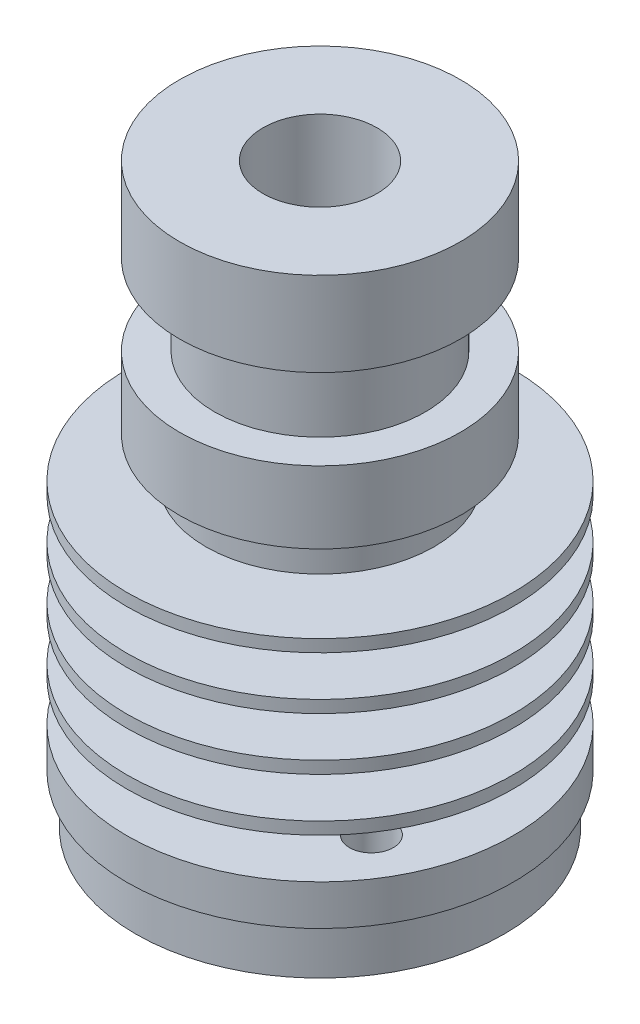
ISO-10303-21;
HEADER;
FILE_DESCRIPTION(('STEP AP214'),'2;1');
FILE_NAME('part.step','',(''),(''),'','','');
FILE_SCHEMA(('AUTOMOTIVE_DESIGN { 1 0 10303 214 1 1 1 1 }'));
ENDSEC;
DATA;
#1=APPLICATION_CONTEXT('core data for automotive mechanical design processes');
#2=APPLICATION_PROTOCOL_DEFINITION('international standard','automotive_design',2000,#1);
#3=PRODUCT_CONTEXT('',#1,'mechanical');
#4=PRODUCT('Part','Part','',(#3));
#5=PRODUCT_RELATED_PRODUCT_CATEGORY('part','',(#4));
#6=PRODUCT_DEFINITION_FORMATION('','',#4);
#7=PRODUCT_DEFINITION_CONTEXT('part definition',#1,'design');
#8=PRODUCT_DEFINITION('design','',#6,#7);
#9=PRODUCT_DEFINITION_SHAPE('','',#8);
#10=(LENGTH_UNIT() NAMED_UNIT(*) SI_UNIT(.MILLI.,.METRE.));
#11=(NAMED_UNIT(*) PLANE_ANGLE_UNIT() SI_UNIT($,.RADIAN.));
#12=(NAMED_UNIT(*) SI_UNIT($,.STERADIAN.) SOLID_ANGLE_UNIT());
#13=UNCERTAINTY_MEASURE_WITH_UNIT(LENGTH_MEASURE(1.E-05),#10,'distance_accuracy_value','');
#14=(GEOMETRIC_REPRESENTATION_CONTEXT(3) GLOBAL_UNCERTAINTY_ASSIGNED_CONTEXT((#13)) GLOBAL_UNIT_ASSIGNED_CONTEXT((#10,
#11,#12)) REPRESENTATION_CONTEXT('',''));
#15=CARTESIAN_POINT('',(0.,0.,0.));
#16=DIRECTION('',(0.,0.,1.));
#17=DIRECTION('',(1.,0.,0.));
#18=AXIS2_PLACEMENT_3D('',#15,#16,#17);
#19=CARTESIAN_POINT('',(11.,2.80000000000002,0.));
#20=DIRECTION('',(0.,-1.,0.));
#21=DIRECTION('',(0.,0.,-1.));
#22=AXIS2_PLACEMENT_3D('',#19,#20,#21);
#23=PLANE('',#22);
#24=CARTESIAN_POINT('',(0.,2.80000000000002,0.));
#25=DIRECTION('',(0.,1.,0.));
#26=DIRECTION('',(0.,0.,1.));
#27=AXIS2_PLACEMENT_3D('',#24,#25,#26);
#28=CIRCLE('',#27,11.);
#29=CARTESIAN_POINT('',(0.,2.80000000000002,11.));
#30=VERTEX_POINT('',#29);
#31=EDGE_CURVE('E50',#30,#30,#28,.T.);
#32=ORIENTED_EDGE('',*,*,#31,.F.);
#33=EDGE_LOOP('',(#32));
#34=FACE_BOUND('',#33,.T.);
#35=CARTESIAN_POINT('',(0.,2.80000000000002,0.));
#36=DIRECTION('',(0.,-1.,0.));
#37=DIRECTION('',(0.,0.,-1.));
#38=AXIS2_PLACEMENT_3D('',#35,#36,#37);
#39=CIRCLE('',#38,10.5);
#40=CARTESIAN_POINT('',(0.,2.80000000000002,-10.5));
#41=VERTEX_POINT('',#40);
#42=EDGE_CURVE('E142',#41,#41,#39,.T.);
#43=ORIENTED_EDGE('',*,*,#42,.F.);
#44=EDGE_LOOP('',(#43));
#45=FACE_BOUND('',#44,.T.);
#46=ADVANCED_FACE('F30',(#34,#45),#23,.T.);
#47=CARTESIAN_POINT('',(0.,2.80000000000002,0.));
#48=DIRECTION('',(0.,1.,0.));
#49=DIRECTION('',(0.,0.,1.));
#50=AXIS2_PLACEMENT_3D('',#47,#48,#49);
#51=CYLINDRICAL_SURFACE('',#50,11.);
#52=ORIENTED_EDGE('',*,*,#31,.T.);
#53=EDGE_LOOP('',(#52));
#54=FACE_BOUND('',#53,.T.);
#55=CARTESIAN_POINT('',(0.,5.10000000000002,0.));
#56=DIRECTION('',(0.,1.,0.));
#57=DIRECTION('',(0.,0.,1.));
#58=AXIS2_PLACEMENT_3D('',#55,#56,#57);
#59=CIRCLE('',#58,11.);
#60=CARTESIAN_POINT('',(0.,5.10000000000002,11.));
#61=VERTEX_POINT('',#60);
#62=EDGE_CURVE('E138',#61,#61,#59,.T.);
#63=ORIENTED_EDGE('',*,*,#62,.F.);
#64=EDGE_LOOP('',(#63));
#65=FACE_BOUND('',#64,.T.);
#66=ADVANCED_FACE('F327',(#54,#65),#51,.T.);
#67=CARTESIAN_POINT('',(0.,32.9,0.));
#68=DIRECTION('',(0.,1.,0.));
#69=DIRECTION('',(0.,0.,1.));
#70=AXIS2_PLACEMENT_3D('',#67,#68,#69);
#71=PLANE('',#70);
#72=CARTESIAN_POINT('',(0.,32.8999999999993,0.));
#73=DIRECTION('',(0.,1.,0.));
#74=DIRECTION('',(-1.,0.,0.));
#75=AXIS2_PLACEMENT_3D('',#72,#73,#74);
#76=CIRCLE('',#75,3.24999999997932);
#77=CARTESIAN_POINT('',(-3.24999999997932,32.8999999999993,0.));
#78=VERTEX_POINT('',#77);
#79=EDGE_CURVE('E150',#78,#78,#76,.T.);
#80=ORIENTED_EDGE('',*,*,#79,.F.);
#81=EDGE_LOOP('',(#80));
#82=FACE_BOUND('',#81,.T.);
#83=CARTESIAN_POINT('',(0.,32.9,0.));
#84=DIRECTION('',(0.,1.,0.));
#85=DIRECTION('',(0.,0.,1.));
#86=AXIS2_PLACEMENT_3D('',#83,#84,#85);
#87=CIRCLE('',#86,8.00000000000011);
#88=CARTESIAN_POINT('',(0.,32.9,8.00000000000011));
#89=VERTEX_POINT('',#88);
#90=EDGE_CURVE('E66',#89,#89,#87,.T.);
#91=ORIENTED_EDGE('',*,*,#90,.T.);
#92=EDGE_LOOP('',(#91));
#93=FACE_BOUND('',#92,.T.);
#94=ADVANCED_FACE('F322',(#82,#93),#71,.T.);
#95=CARTESIAN_POINT('',(0.,2.80000000000002,0.));
#96=DIRECTION('',(0.,1.,0.));
#97=DIRECTION('',(0.,0.,1.));
#98=AXIS2_PLACEMENT_3D('',#95,#96,#97);
#99=CYLINDRICAL_SURFACE('',#98,8.00000000000011);
#100=CARTESIAN_POINT('',(0.,28.1,0.));
#101=DIRECTION('',(0.,1.,0.));
#102=DIRECTION('',(0.,0.,1.));
#103=AXIS2_PLACEMENT_3D('',#100,#101,#102);
#104=CIRCLE('',#103,8.00000000000011);
#105=CARTESIAN_POINT('',(0.,28.1,8.00000000000011));
#106=VERTEX_POINT('',#105);
#107=EDGE_CURVE('E69',#106,#106,#104,.T.);
#108=ORIENTED_EDGE('',*,*,#107,.T.);
#109=EDGE_LOOP('',(#108));
#110=FACE_BOUND('',#109,.T.);
#111=ORIENTED_EDGE('',*,*,#90,.F.);
#112=EDGE_LOOP('',(#111));
#113=FACE_BOUND('',#112,.T.);
#114=ADVANCED_FACE('F316',(#110,#113),#99,.T.);
#115=CARTESIAN_POINT('',(8.00000000000011,28.1,0.));
#116=DIRECTION('',(0.,-1.,0.));
#117=DIRECTION('',(0.,0.,-1.));
#118=AXIS2_PLACEMENT_3D('',#115,#116,#117);
#119=PLANE('',#118);
#120=CARTESIAN_POINT('',(0.,28.1,0.));
#121=DIRECTION('',(0.,1.,0.));
#122=DIRECTION('',(0.,0.,1.));
#123=AXIS2_PLACEMENT_3D('',#120,#121,#122);
#124=CIRCLE('',#123,6.00000000000008);
#125=CARTESIAN_POINT('',(0.,28.1,6.00000000000008));
#126=VERTEX_POINT('',#125);
#127=EDGE_CURVE('E72',#126,#126,#124,.T.);
#128=ORIENTED_EDGE('',*,*,#127,.T.);
#129=EDGE_LOOP('',(#128));
#130=FACE_BOUND('',#129,.T.);
#131=ORIENTED_EDGE('',*,*,#107,.F.);
#132=EDGE_LOOP('',(#131));
#133=FACE_BOUND('',#132,.T.);
#134=ADVANCED_FACE('F310',(#130,#133),#119,.T.);
#135=CARTESIAN_POINT('',(0.,2.80000000000002,0.));
#136=DIRECTION('',(0.,1.,0.));
#137=DIRECTION('',(0.,0.,1.));
#138=AXIS2_PLACEMENT_3D('',#135,#136,#137);
#139=CYLINDRICAL_SURFACE('',#138,6.00000000000008);
#140=CARTESIAN_POINT('',(0.,23.5,0.));
#141=DIRECTION('',(0.,1.,0.));
#142=DIRECTION('',(0.,0.,1.));
#143=AXIS2_PLACEMENT_3D('',#140,#141,#142);
#144=CIRCLE('',#143,6.00000000000008);
#145=CARTESIAN_POINT('',(0.,23.5,6.00000000000008));
#146=VERTEX_POINT('',#145);
#147=EDGE_CURVE('E75',#146,#146,#144,.T.);
#148=ORIENTED_EDGE('',*,*,#147,.T.);
#149=EDGE_LOOP('',(#148));
#150=FACE_BOUND('',#149,.T.);
#151=ORIENTED_EDGE('',*,*,#127,.F.);
#152=EDGE_LOOP('',(#151));
#153=FACE_BOUND('',#152,.T.);
#154=ADVANCED_FACE('F304',(#150,#153),#139,.T.);
#155=CARTESIAN_POINT('',(6.00000000000008,23.5,0.));
#156=DIRECTION('',(0.,1.,0.));
#157=DIRECTION('',(0.,0.,1.));
#158=AXIS2_PLACEMENT_3D('',#155,#156,#157);
#159=PLANE('',#158);
#160=CARTESIAN_POINT('',(0.,23.5,0.));
#161=DIRECTION('',(0.,1.,0.));
#162=DIRECTION('',(0.,0.,1.));
#163=AXIS2_PLACEMENT_3D('',#160,#161,#162);
#164=CIRCLE('',#163,8.00000000000012);
#165=CARTESIAN_POINT('',(0.,23.5,8.00000000000012));
#166=VERTEX_POINT('',#165);
#167=EDGE_CURVE('E78',#166,#166,#164,.T.);
#168=ORIENTED_EDGE('',*,*,#167,.T.);
#169=EDGE_LOOP('',(#168));
#170=FACE_BOUND('',#169,.T.);
#171=ORIENTED_EDGE('',*,*,#147,.F.);
#172=EDGE_LOOP('',(#171));
#173=FACE_BOUND('',#172,.T.);
#174=ADVANCED_FACE('F298',(#170,#173),#159,.T.);
#175=CARTESIAN_POINT('',(0.,2.80000000000002,0.));
#176=DIRECTION('',(0.,1.,0.));
#177=DIRECTION('',(0.,0.,1.));
#178=AXIS2_PLACEMENT_3D('',#175,#176,#177);
#179=CYLINDRICAL_SURFACE('',#178,8.00000000000012);
#180=CARTESIAN_POINT('',(0.,19.4,0.));
#181=DIRECTION('',(0.,1.,0.));
#182=DIRECTION('',(0.,0.,1.));
#183=AXIS2_PLACEMENT_3D('',#180,#181,#182);
#184=CIRCLE('',#183,8.00000000000012);
#185=CARTESIAN_POINT('',(0.,19.4,8.00000000000012));
#186=VERTEX_POINT('',#185);
#187=EDGE_CURVE('E81',#186,#186,#184,.T.);
#188=ORIENTED_EDGE('',*,*,#187,.T.);
#189=EDGE_LOOP('',(#188));
#190=FACE_BOUND('',#189,.T.);
#191=ORIENTED_EDGE('',*,*,#167,.F.);
#192=EDGE_LOOP('',(#191));
#193=FACE_BOUND('',#192,.T.);
#194=ADVANCED_FACE('F292',(#190,#193),#179,.T.);
#195=CARTESIAN_POINT('',(8.00000000000012,19.4,0.));
#196=DIRECTION('',(0.,-1.,0.));
#197=DIRECTION('',(0.,0.,-1.));
#198=AXIS2_PLACEMENT_3D('',#195,#196,#197);
#199=PLANE('',#198);
#200=CARTESIAN_POINT('',(0.,19.4,0.));
#201=DIRECTION('',(0.,1.,0.));
#202=DIRECTION('',(0.,0.,1.));
#203=AXIS2_PLACEMENT_3D('',#200,#201,#202);
#204=CIRCLE('',#203,6.50000000000001);
#205=CARTESIAN_POINT('',(0.,19.4,6.50000000000001));
#206=VERTEX_POINT('',#205);
#207=EDGE_CURVE('E84',#206,#206,#204,.T.);
#208=ORIENTED_EDGE('',*,*,#207,.T.);
#209=EDGE_LOOP('',(#208));
#210=FACE_BOUND('',#209,.T.);
#211=ORIENTED_EDGE('',*,*,#187,.F.);
#212=EDGE_LOOP('',(#211));
#213=FACE_BOUND('',#212,.T.);
#214=ADVANCED_FACE('F286',(#210,#213),#199,.T.);
#215=CARTESIAN_POINT('',(0.,2.80000000000002,0.));
#216=DIRECTION('',(0.,1.,0.));
#217=DIRECTION('',(0.,0.,1.));
#218=AXIS2_PLACEMENT_3D('',#215,#216,#217);
#219=CYLINDRICAL_SURFACE('',#218,6.50000000000001);
#220=CARTESIAN_POINT('',(0.,17.1,0.));
#221=DIRECTION('',(0.,1.,0.));
#222=DIRECTION('',(0.,0.,1.));
#223=AXIS2_PLACEMENT_3D('',#220,#221,#222);
#224=CIRCLE('',#223,6.50000000000001);
#225=CARTESIAN_POINT('',(0.,17.1,6.50000000000001));
#226=VERTEX_POINT('',#225);
#227=EDGE_CURVE('E87',#226,#226,#224,.T.);
#228=ORIENTED_EDGE('',*,*,#227,.T.);
#229=EDGE_LOOP('',(#228));
#230=FACE_BOUND('',#229,.T.);
#231=ORIENTED_EDGE('',*,*,#207,.F.);
#232=EDGE_LOOP('',(#231));
#233=FACE_BOUND('',#232,.T.);
#234=ADVANCED_FACE('F280',(#230,#233),#219,.T.);
#235=CARTESIAN_POINT('',(6.50000000000001,17.1,0.));
#236=DIRECTION('',(0.,1.,0.));
#237=DIRECTION('',(0.,0.,1.));
#238=AXIS2_PLACEMENT_3D('',#235,#236,#237);
#239=PLANE('',#238);
#240=CARTESIAN_POINT('',(0.,17.1,0.));
#241=DIRECTION('',(0.,1.,0.));
#242=DIRECTION('',(0.,0.,1.));
#243=AXIS2_PLACEMENT_3D('',#240,#241,#242);
#244=CIRCLE('',#243,11.);
#245=CARTESIAN_POINT('',(0.,17.1,11.));
#246=VERTEX_POINT('',#245);
#247=EDGE_CURVE('E90',#246,#246,#244,.T.);
#248=ORIENTED_EDGE('',*,*,#247,.T.);
#249=EDGE_LOOP('',(#248));
#250=FACE_BOUND('',#249,.T.);
#251=ORIENTED_EDGE('',*,*,#227,.F.);
#252=EDGE_LOOP('',(#251));
#253=FACE_BOUND('',#252,.T.);
#254=ADVANCED_FACE('F274',(#250,#253),#239,.T.);
#255=CARTESIAN_POINT('',(0.,2.80000000000002,0.));
#256=DIRECTION('',(0.,1.,0.));
#257=DIRECTION('',(0.,0.,1.));
#258=AXIS2_PLACEMENT_3D('',#255,#256,#257);
#259=CYLINDRICAL_SURFACE('',#258,11.);
#260=CARTESIAN_POINT('',(0.,16.4,0.));
#261=DIRECTION('',(0.,1.,0.));
#262=DIRECTION('',(0.,0.,1.));
#263=AXIS2_PLACEMENT_3D('',#260,#261,#262);
#264=CIRCLE('',#263,11.);
#265=CARTESIAN_POINT('',(0.,16.4,11.));
#266=VERTEX_POINT('',#265);
#267=EDGE_CURVE('E93',#266,#266,#264,.T.);
#268=ORIENTED_EDGE('',*,*,#267,.T.);
#269=EDGE_LOOP('',(#268));
#270=FACE_BOUND('',#269,.T.);
#271=ORIENTED_EDGE('',*,*,#247,.F.);
#272=EDGE_LOOP('',(#271));
#273=FACE_BOUND('',#272,.T.);
#274=ADVANCED_FACE('F268',(#270,#273),#259,.T.);
#275=CARTESIAN_POINT('',(11.,16.4,0.));
#276=DIRECTION('',(0.,-1.,0.));
#277=DIRECTION('',(0.,0.,-1.));
#278=AXIS2_PLACEMENT_3D('',#275,#276,#277);
#279=PLANE('',#278);
#280=CARTESIAN_POINT('',(0.,16.4,0.));
#281=DIRECTION('',(0.,1.,0.));
#282=DIRECTION('',(0.,0.,1.));
#283=AXIS2_PLACEMENT_3D('',#280,#281,#282);
#284=CIRCLE('',#283,6.49999999999999);
#285=CARTESIAN_POINT('',(0.,16.4,6.49999999999999));
#286=VERTEX_POINT('',#285);
#287=EDGE_CURVE('E96',#286,#286,#284,.T.);
#288=ORIENTED_EDGE('',*,*,#287,.T.);
#289=EDGE_LOOP('',(#288));
#290=FACE_BOUND('',#289,.T.);
#291=ORIENTED_EDGE('',*,*,#267,.F.);
#292=EDGE_LOOP('',(#291));
#293=FACE_BOUND('',#292,.T.);
#294=ADVANCED_FACE('F262',(#290,#293),#279,.T.);
#295=CARTESIAN_POINT('',(0.,2.80000000000002,0.));
#296=DIRECTION('',(0.,1.,0.));
#297=DIRECTION('',(0.,0.,1.));
#298=AXIS2_PLACEMENT_3D('',#295,#296,#297);
#299=CYLINDRICAL_SURFACE('',#298,6.49999999999999);
#300=CARTESIAN_POINT('',(0.,14.1,0.));
#301=DIRECTION('',(0.,1.,0.));
#302=DIRECTION('',(0.,0.,1.));
#303=AXIS2_PLACEMENT_3D('',#300,#301,#302);
#304=CIRCLE('',#303,6.49999999999999);
#305=CARTESIAN_POINT('',(0.,14.1,6.49999999999999));
#306=VERTEX_POINT('',#305);
#307=EDGE_CURVE('E99',#306,#306,#304,.T.);
#308=ORIENTED_EDGE('',*,*,#307,.T.);
#309=EDGE_LOOP('',(#308));
#310=FACE_BOUND('',#309,.T.);
#311=ORIENTED_EDGE('',*,*,#287,.F.);
#312=EDGE_LOOP('',(#311));
#313=FACE_BOUND('',#312,.T.);
#314=ADVANCED_FACE('F256',(#310,#313),#299,.T.);
#315=CARTESIAN_POINT('',(6.49999999999999,14.1,0.));
#316=DIRECTION('',(0.,1.,0.));
#317=DIRECTION('',(0.,0.,1.));
#318=AXIS2_PLACEMENT_3D('',#315,#316,#317);
#319=PLANE('',#318);
#320=CARTESIAN_POINT('',(0.,14.1,0.));
#321=DIRECTION('',(0.,1.,0.));
#322=DIRECTION('',(0.,0.,1.));
#323=AXIS2_PLACEMENT_3D('',#320,#321,#322);
#324=CIRCLE('',#323,11.);
#325=CARTESIAN_POINT('',(0.,14.1,11.));
#326=VERTEX_POINT('',#325);
#327=EDGE_CURVE('E102',#326,#326,#324,.T.);
#328=ORIENTED_EDGE('',*,*,#327,.T.);
#329=EDGE_LOOP('',(#328));
#330=FACE_BOUND('',#329,.T.);
#331=ORIENTED_EDGE('',*,*,#307,.F.);
#332=EDGE_LOOP('',(#331));
#333=FACE_BOUND('',#332,.T.);
#334=ADVANCED_FACE('F250',(#330,#333),#319,.T.);
#335=CARTESIAN_POINT('',(0.,2.80000000000002,0.));
#336=DIRECTION('',(0.,1.,0.));
#337=DIRECTION('',(0.,0.,1.));
#338=AXIS2_PLACEMENT_3D('',#335,#336,#337);
#339=CYLINDRICAL_SURFACE('',#338,11.);
#340=CARTESIAN_POINT('',(0.,13.4,0.));
#341=DIRECTION('',(0.,1.,0.));
#342=DIRECTION('',(0.,0.,1.));
#343=AXIS2_PLACEMENT_3D('',#340,#341,#342);
#344=CIRCLE('',#343,11.);
#345=CARTESIAN_POINT('',(0.,13.4,11.));
#346=VERTEX_POINT('',#345);
#347=EDGE_CURVE('E105',#346,#346,#344,.T.);
#348=ORIENTED_EDGE('',*,*,#347,.T.);
#349=EDGE_LOOP('',(#348));
#350=FACE_BOUND('',#349,.T.);
#351=ORIENTED_EDGE('',*,*,#327,.F.);
#352=EDGE_LOOP('',(#351));
#353=FACE_BOUND('',#352,.T.);
#354=ADVANCED_FACE('F244',(#350,#353),#339,.T.);
#355=CARTESIAN_POINT('',(11.,13.4,0.));
#356=DIRECTION('',(0.,-1.,0.));
#357=DIRECTION('',(0.,0.,-1.));
#358=AXIS2_PLACEMENT_3D('',#355,#356,#357);
#359=PLANE('',#358);
#360=CARTESIAN_POINT('',(0.,13.4,0.));
#361=DIRECTION('',(0.,1.,0.));
#362=DIRECTION('',(0.,0.,1.));
#363=AXIS2_PLACEMENT_3D('',#360,#361,#362);
#364=CIRCLE('',#363,6.49999999999999);
#365=CARTESIAN_POINT('',(0.,13.4,6.49999999999999));
#366=VERTEX_POINT('',#365);
#367=EDGE_CURVE('E108',#366,#366,#364,.T.);
#368=ORIENTED_EDGE('',*,*,#367,.T.);
#369=EDGE_LOOP('',(#368));
#370=FACE_BOUND('',#369,.T.);
#371=ORIENTED_EDGE('',*,*,#347,.F.);
#372=EDGE_LOOP('',(#371));
#373=FACE_BOUND('',#372,.T.);
#374=ADVANCED_FACE('F238',(#370,#373),#359,.T.);
#375=CARTESIAN_POINT('',(0.,2.80000000000002,0.));
#376=DIRECTION('',(0.,1.,0.));
#377=DIRECTION('',(0.,0.,1.));
#378=AXIS2_PLACEMENT_3D('',#375,#376,#377);
#379=CYLINDRICAL_SURFACE('',#378,6.49999999999999);
#380=CARTESIAN_POINT('',(0.,11.1,0.));
#381=DIRECTION('',(0.,1.,0.));
#382=DIRECTION('',(0.,0.,1.));
#383=AXIS2_PLACEMENT_3D('',#380,#381,#382);
#384=CIRCLE('',#383,6.49999999999999);
#385=CARTESIAN_POINT('',(0.,11.1,6.49999999999999));
#386=VERTEX_POINT('',#385);
#387=EDGE_CURVE('E111',#386,#386,#384,.T.);
#388=ORIENTED_EDGE('',*,*,#387,.T.);
#389=EDGE_LOOP('',(#388));
#390=FACE_BOUND('',#389,.T.);
#391=ORIENTED_EDGE('',*,*,#367,.F.);
#392=EDGE_LOOP('',(#391));
#393=FACE_BOUND('',#392,.T.);
#394=ADVANCED_FACE('F232',(#390,#393),#379,.T.);
#395=CARTESIAN_POINT('',(6.49999999999999,11.1,0.));
#396=DIRECTION('',(0.,1.,0.));
#397=DIRECTION('',(0.,0.,1.));
#398=AXIS2_PLACEMENT_3D('',#395,#396,#397);
#399=PLANE('',#398);
#400=CARTESIAN_POINT('',(0.,11.1,0.));
#401=DIRECTION('',(0.,1.,0.));
#402=DIRECTION('',(0.,0.,1.));
#403=AXIS2_PLACEMENT_3D('',#400,#401,#402);
#404=CIRCLE('',#403,11.);
#405=CARTESIAN_POINT('',(0.,11.1,11.));
#406=VERTEX_POINT('',#405);
#407=EDGE_CURVE('E114',#406,#406,#404,.T.);
#408=ORIENTED_EDGE('',*,*,#407,.T.);
#409=EDGE_LOOP('',(#408));
#410=FACE_BOUND('',#409,.T.);
#411=ORIENTED_EDGE('',*,*,#387,.F.);
#412=EDGE_LOOP('',(#411));
#413=FACE_BOUND('',#412,.T.);
#414=ADVANCED_FACE('F226',(#410,#413),#399,.T.);
#415=CARTESIAN_POINT('',(0.,2.80000000000002,0.));
#416=DIRECTION('',(0.,1.,0.));
#417=DIRECTION('',(0.,0.,1.));
#418=AXIS2_PLACEMENT_3D('',#415,#416,#417);
#419=CYLINDRICAL_SURFACE('',#418,11.);
#420=CARTESIAN_POINT('',(0.,10.4,0.));
#421=DIRECTION('',(0.,1.,0.));
#422=DIRECTION('',(0.,0.,1.));
#423=AXIS2_PLACEMENT_3D('',#420,#421,#422);
#424=CIRCLE('',#423,11.);
#425=CARTESIAN_POINT('',(0.,10.4,11.));
#426=VERTEX_POINT('',#425);
#427=EDGE_CURVE('E117',#426,#426,#424,.T.);
#428=ORIENTED_EDGE('',*,*,#427,.T.);
#429=EDGE_LOOP('',(#428));
#430=FACE_BOUND('',#429,.T.);
#431=ORIENTED_EDGE('',*,*,#407,.F.);
#432=EDGE_LOOP('',(#431));
#433=FACE_BOUND('',#432,.T.);
#434=ADVANCED_FACE('F220',(#430,#433),#419,.T.);
#435=CARTESIAN_POINT('',(11.,10.4,0.));
#436=DIRECTION('',(0.,-1.,0.));
#437=DIRECTION('',(0.,0.,-1.));
#438=AXIS2_PLACEMENT_3D('',#435,#436,#437);
#439=PLANE('',#438);
#440=CARTESIAN_POINT('',(0.,10.4,0.));
#441=DIRECTION('',(0.,1.,0.));
#442=DIRECTION('',(0.,0.,1.));
#443=AXIS2_PLACEMENT_3D('',#440,#441,#442);
#444=CIRCLE('',#443,6.49999999999999);
#445=CARTESIAN_POINT('',(0.,10.4,6.49999999999999));
#446=VERTEX_POINT('',#445);
#447=EDGE_CURVE('E120',#446,#446,#444,.T.);
#448=ORIENTED_EDGE('',*,*,#447,.T.);
#449=EDGE_LOOP('',(#448));
#450=FACE_BOUND('',#449,.T.);
#451=ORIENTED_EDGE('',*,*,#427,.F.);
#452=EDGE_LOOP('',(#451));
#453=FACE_BOUND('',#452,.T.);
#454=ADVANCED_FACE('F214',(#450,#453),#439,.T.);
#455=CARTESIAN_POINT('',(0.,2.80000000000002,0.));
#456=DIRECTION('',(0.,1.,0.));
#457=DIRECTION('',(0.,0.,1.));
#458=AXIS2_PLACEMENT_3D('',#455,#456,#457);
#459=CYLINDRICAL_SURFACE('',#458,6.49999999999999);
#460=CARTESIAN_POINT('',(0.,8.10000000000002,0.));
#461=DIRECTION('',(0.,1.,0.));
#462=DIRECTION('',(0.,0.,1.));
#463=AXIS2_PLACEMENT_3D('',#460,#461,#462);
#464=CIRCLE('',#463,6.49999999999999);
#465=CARTESIAN_POINT('',(0.,8.10000000000002,6.49999999999999));
#466=VERTEX_POINT('',#465);
#467=EDGE_CURVE('E123',#466,#466,#464,.T.);
#468=ORIENTED_EDGE('',*,*,#467,.T.);
#469=EDGE_LOOP('',(#468));
#470=FACE_BOUND('',#469,.T.);
#471=ORIENTED_EDGE('',*,*,#447,.F.);
#472=EDGE_LOOP('',(#471));
#473=FACE_BOUND('',#472,.T.);
#474=ADVANCED_FACE('F208',(#470,#473),#459,.T.);
#475=CARTESIAN_POINT('',(6.49999999999999,8.10000000000002,0.));
#476=DIRECTION('',(0.,1.,0.));
#477=DIRECTION('',(0.,0.,1.));
#478=AXIS2_PLACEMENT_3D('',#475,#476,#477);
#479=PLANE('',#478);
#480=CARTESIAN_POINT('',(0.,8.10000000000002,0.));
#481=DIRECTION('',(0.,1.,0.));
#482=DIRECTION('',(0.,0.,1.));
#483=AXIS2_PLACEMENT_3D('',#480,#481,#482);
#484=CIRCLE('',#483,11.);
#485=CARTESIAN_POINT('',(0.,8.10000000000002,11.));
#486=VERTEX_POINT('',#485);
#487=EDGE_CURVE('E126',#486,#486,#484,.T.);
#488=ORIENTED_EDGE('',*,*,#487,.T.);
#489=EDGE_LOOP('',(#488));
#490=FACE_BOUND('',#489,.T.);
#491=ORIENTED_EDGE('',*,*,#467,.F.);
#492=EDGE_LOOP('',(#491));
#493=FACE_BOUND('',#492,.T.);
#494=ADVANCED_FACE('F202',(#490,#493),#479,.T.);
#495=CARTESIAN_POINT('',(0.,2.80000000000002,0.));
#496=DIRECTION('',(0.,1.,0.));
#497=DIRECTION('',(0.,0.,1.));
#498=AXIS2_PLACEMENT_3D('',#495,#496,#497);
#499=CYLINDRICAL_SURFACE('',#498,11.);
#500=CARTESIAN_POINT('',(0.,7.40000000000002,0.));
#501=DIRECTION('',(0.,1.,0.));
#502=DIRECTION('',(0.,0.,1.));
#503=AXIS2_PLACEMENT_3D('',#500,#501,#502);
#504=CIRCLE('',#503,11.);
#505=CARTESIAN_POINT('',(0.,7.40000000000002,11.));
#506=VERTEX_POINT('',#505);
#507=EDGE_CURVE('E129',#506,#506,#504,.T.);
#508=ORIENTED_EDGE('',*,*,#507,.T.);
#509=EDGE_LOOP('',(#508));
#510=FACE_BOUND('',#509,.T.);
#511=ORIENTED_EDGE('',*,*,#487,.F.);
#512=EDGE_LOOP('',(#511));
#513=FACE_BOUND('',#512,.T.);
#514=ADVANCED_FACE('F196',(#510,#513),#499,.T.);
#515=CARTESIAN_POINT('',(11.,7.40000000000002,0.));
#516=DIRECTION('',(0.,-1.,0.));
#517=DIRECTION('',(0.,0.,-1.));
#518=AXIS2_PLACEMENT_3D('',#515,#516,#517);
#519=PLANE('',#518);
#520=CARTESIAN_POINT('',(0.,7.40000000000002,0.));
#521=DIRECTION('',(0.,1.,0.));
#522=DIRECTION('',(0.,0.,1.));
#523=AXIS2_PLACEMENT_3D('',#520,#521,#522);
#524=CIRCLE('',#523,6.49999999999999);
#525=CARTESIAN_POINT('',(0.,7.40000000000002,6.49999999999999));
#526=VERTEX_POINT('',#525);
#527=EDGE_CURVE('E132',#526,#526,#524,.T.);
#528=ORIENTED_EDGE('',*,*,#527,.T.);
#529=EDGE_LOOP('',(#528));
#530=FACE_BOUND('',#529,.T.);
#531=ORIENTED_EDGE('',*,*,#507,.F.);
#532=EDGE_LOOP('',(#531));
#533=FACE_BOUND('',#532,.T.);
#534=ADVANCED_FACE('F190',(#530,#533),#519,.T.);
#535=CARTESIAN_POINT('',(0.,2.80000000000002,0.));
#536=DIRECTION('',(0.,1.,0.));
#537=DIRECTION('',(0.,0.,1.));
#538=AXIS2_PLACEMENT_3D('',#535,#536,#537);
#539=CYLINDRICAL_SURFACE('',#538,6.49999999999999);
#540=CARTESIAN_POINT('',(0.,5.10000000000002,0.));
#541=DIRECTION('',(0.,1.,0.));
#542=DIRECTION('',(0.,0.,1.));
#543=AXIS2_PLACEMENT_3D('',#540,#541,#542);
#544=CIRCLE('',#543,6.49999999999999);
#545=CARTESIAN_POINT('',(0.,5.10000000000002,6.49999999999999));
#546=VERTEX_POINT('',#545);
#547=EDGE_CURVE('E135',#546,#546,#544,.T.);
#548=ORIENTED_EDGE('',*,*,#547,.T.);
#549=EDGE_LOOP('',(#548));
#550=FACE_BOUND('',#549,.T.);
#551=ORIENTED_EDGE('',*,*,#527,.F.);
#552=EDGE_LOOP('',(#551));
#553=FACE_BOUND('',#552,.T.);
#554=ADVANCED_FACE('F178',(#550,#553),#539,.T.);
#555=CARTESIAN_POINT('',(6.49999999999999,5.10000000000002,0.));
#556=DIRECTION('',(0.,1.,0.));
#557=DIRECTION('',(0.,0.,1.));
#558=AXIS2_PLACEMENT_3D('',#555,#556,#557);
#559=PLANE('',#558);
#560=CARTESIAN_POINT('',(-6.92820323027552,5.10000000000002,4.));
#561=DIRECTION('',(0.,1.,0.));
#562=DIRECTION('',(0.,0.,1.));
#563=AXIS2_PLACEMENT_3D('',#560,#561,#562);
#564=CIRCLE('',#563,1.24999999999999);
#565=CARTESIAN_POINT('',(-6.92820323027552,5.10000000000002,5.24999999999999));
#566=VERTEX_POINT('',#565);
#567=EDGE_CURVE('E55',#566,#566,#564,.T.);
#568=ORIENTED_EDGE('',*,*,#567,.F.);
#569=EDGE_LOOP('',(#568));
#570=FACE_BOUND('',#569,.T.);
#571=CARTESIAN_POINT('',(0.,5.10000000000002,-8.));
#572=DIRECTION('',(0.,1.,0.));
#573=DIRECTION('',(0.,0.,1.));
#574=AXIS2_PLACEMENT_3D('',#571,#572,#573);
#575=CIRCLE('',#574,1.24999999999999);
#576=CARTESIAN_POINT('',(0.,5.10000000000002,-6.75000000000001));
#577=VERTEX_POINT('',#576);
#578=EDGE_CURVE('E54',#577,#577,#575,.T.);
#579=ORIENTED_EDGE('',*,*,#578,.F.);
#580=EDGE_LOOP('',(#579));
#581=FACE_BOUND('',#580,.T.);
#582=CARTESIAN_POINT('',(6.9282032302755,5.10000000000002,4.));
#583=DIRECTION('',(0.,1.,0.));
#584=DIRECTION('',(0.,0.,1.));
#585=AXIS2_PLACEMENT_3D('',#582,#583,#584);
#586=CIRCLE('',#585,1.24999999999999);
#587=CARTESIAN_POINT('',(6.9282032302755,5.10000000000002,5.24999999999999));
#588=VERTEX_POINT('',#587);
#589=EDGE_CURVE('E59',#588,#588,#586,.T.);
#590=ORIENTED_EDGE('',*,*,#589,.F.);
#591=EDGE_LOOP('',(#590));
#592=FACE_BOUND('',#591,.T.);
#593=ORIENTED_EDGE('',*,*,#62,.T.);
#594=EDGE_LOOP('',(#593));
#595=FACE_BOUND('',#594,.T.);
#596=ORIENTED_EDGE('',*,*,#547,.F.);
#597=EDGE_LOOP('',(#596));
#598=FACE_BOUND('',#597,.T.);
#599=ADVANCED_FACE('F174',(#570,#581,#592,#595,#598),#559,.T.);
#600=CARTESIAN_POINT('',(0.,0.,0.));
#601=DIRECTION('',(0.,1.,0.));
#602=DIRECTION('',(0.,0.,1.));
#603=AXIS2_PLACEMENT_3D('',#600,#601,#602);
#604=CYLINDRICAL_SURFACE('',#603,10.5);
#605=CARTESIAN_POINT('',(0.,0.,0.));
#606=DIRECTION('',(0.,-1.,0.));
#607=DIRECTION('',(0.,0.,-1.));
#608=AXIS2_PLACEMENT_3D('',#605,#606,#607);
#609=CIRCLE('',#608,10.5);
#610=CARTESIAN_POINT('',(0.,0.,-10.5));
#611=VERTEX_POINT('',#610);
#612=EDGE_CURVE('E141',#611,#611,#609,.T.);
#613=ORIENTED_EDGE('',*,*,#612,.F.);
#614=EDGE_LOOP('',(#613));
#615=FACE_BOUND('',#614,.T.);
#616=ORIENTED_EDGE('',*,*,#42,.T.);
#617=EDGE_LOOP('',(#616));
#618=FACE_BOUND('',#617,.T.);
#619=ADVANCED_FACE('F177',(#615,#618),#604,.T.);
#620=CARTESIAN_POINT('',(0.,0.,0.));
#621=DIRECTION('',(0.,-1.,0.));
#622=DIRECTION('',(0.,0.,-1.));
#623=AXIS2_PLACEMENT_3D('',#620,#621,#622);
#624=PLANE('',#623);
#625=CARTESIAN_POINT('',(0.,0.,0.));
#626=DIRECTION('',(0.,1.,0.));
#627=DIRECTION('',(-1.,0.,0.));
#628=AXIS2_PLACEMENT_3D('',#625,#626,#627);
#629=CIRCLE('',#628,9.75);
#630=CARTESIAN_POINT('',(-9.75,0.,0.));
#631=VERTEX_POINT('',#630);
#632=EDGE_CURVE('E145',#631,#631,#629,.T.);
#633=ORIENTED_EDGE('',*,*,#632,.T.);
#634=EDGE_LOOP('',(#633));
#635=FACE_BOUND('',#634,.T.);
#636=ORIENTED_EDGE('',*,*,#612,.T.);
#637=EDGE_LOOP('',(#636));
#638=FACE_BOUND('',#637,.T.);
#639=ADVANCED_FACE('F389',(#635,#638),#624,.T.);
#640=CARTESIAN_POINT('',(0.,0.,0.));
#641=DIRECTION('',(0.,1.,0.));
#642=DIRECTION('',(-1.,0.,0.));
#643=AXIS2_PLACEMENT_3D('',#640,#641,#642);
#644=CYLINDRICAL_SURFACE('',#643,9.75);
#645=ORIENTED_EDGE('',*,*,#632,.F.);
#646=EDGE_LOOP('',(#645));
#647=FACE_BOUND('',#646,.T.);
#648=CARTESIAN_POINT('',(0.,1.55000000000003,0.));
#649=DIRECTION('',(0.,1.,0.));
#650=DIRECTION('',(-1.,0.,0.));
#651=AXIS2_PLACEMENT_3D('',#648,#649,#650);
#652=CIRCLE('',#651,9.75);
#653=CARTESIAN_POINT('',(-9.75,1.55000000000003,0.));
#654=VERTEX_POINT('',#653);
#655=EDGE_CURVE('E63',#654,#654,#652,.T.);
#656=ORIENTED_EDGE('',*,*,#655,.T.);
#657=EDGE_LOOP('',(#656));
#658=FACE_BOUND('',#657,.T.);
#659=ADVANCED_FACE('F385',(#647,#658),#644,.F.);
#660=CARTESIAN_POINT('',(0.,0.,0.));
#661=DIRECTION('',(0.,1.,0.));
#662=DIRECTION('',(-1.,0.,0.));
#663=AXIS2_PLACEMENT_3D('',#660,#661,#662);
#664=CYLINDRICAL_SURFACE('',#663,3.24999999997932);
#665=CARTESIAN_POINT('',(0.,11.5000000000684,0.));
#666=DIRECTION('',(0.,1.,0.));
#667=DIRECTION('',(-1.,0.,0.));
#668=AXIS2_PLACEMENT_3D('',#665,#666,#667);
#669=CIRCLE('',#668,3.24999999997931);
#670=CARTESIAN_POINT('',(-3.24999999997931,11.5000000000684,0.));
#671=VERTEX_POINT('',#670);
#672=EDGE_CURVE('E153',#671,#671,#669,.T.);
#673=ORIENTED_EDGE('',*,*,#672,.F.);
#674=EDGE_LOOP('',(#673));
#675=FACE_BOUND('',#674,.T.);
#676=ORIENTED_EDGE('',*,*,#79,.T.);
#677=EDGE_LOOP('',(#676));
#678=FACE_BOUND('',#677,.T.);
#679=ADVANCED_FACE('F381',(#675,#678),#664,.F.);
#680=CARTESIAN_POINT('',(0.,11.5000000000684,0.));
#681=DIRECTION('',(0.,-1.,0.));
#682=DIRECTION('',(1.,0.,0.));
#683=AXIS2_PLACEMENT_3D('',#680,#681,#682);
#684=CONICAL_SURFACE('',#683,3.24999999997931,0.785398163397448);
#685=CARTESIAN_POINT('',(0.,10.0000000000477,0.));
#686=DIRECTION('',(0.,1.,0.));
#687=DIRECTION('',(-1.,0.,0.));
#688=AXIS2_PLACEMENT_3D('',#685,#686,#687);
#689=CIRCLE('',#688,4.75000000000001);
#690=CARTESIAN_POINT('',(-4.75000000000001,10.0000000000477,0.));
#691=VERTEX_POINT('',#690);
#692=EDGE_CURVE('E156',#691,#691,#689,.T.);
#693=ORIENTED_EDGE('',*,*,#692,.F.);
#694=EDGE_LOOP('',(#693));
#695=FACE_BOUND('',#694,.T.);
#696=ORIENTED_EDGE('',*,*,#672,.T.);
#697=EDGE_LOOP('',(#696));
#698=FACE_BOUND('',#697,.T.);
#699=ADVANCED_FACE('F377',(#695,#698),#684,.F.);
#700=CARTESIAN_POINT('',(0.,0.,0.));
#701=DIRECTION('',(0.,1.,0.));
#702=DIRECTION('',(-1.,0.,0.));
#703=AXIS2_PLACEMENT_3D('',#700,#701,#702);
#704=CYLINDRICAL_SURFACE('',#703,4.75000000000001);
#705=CARTESIAN_POINT('',(0.,5.05000000003837,0.));
#706=DIRECTION('',(0.,1.,0.));
#707=DIRECTION('',(-1.,0.,0.));
#708=AXIS2_PLACEMENT_3D('',#705,#706,#707);
#709=CIRCLE('',#708,4.75000000000001);
#710=CARTESIAN_POINT('',(-4.75000000000001,5.05000000003837,0.));
#711=VERTEX_POINT('',#710);
#712=EDGE_CURVE('E41',#711,#711,#709,.F.);
#713=ORIENTED_EDGE('',*,*,#712,.T.);
#714=EDGE_LOOP('',(#713));
#715=FACE_BOUND('',#714,.T.);
#716=ORIENTED_EDGE('',*,*,#692,.T.);
#717=EDGE_LOOP('',(#716));
#718=FACE_BOUND('',#717,.T.);
#719=ADVANCED_FACE('F361',(#715,#718),#704,.F.);
#720=CARTESIAN_POINT('',(4.75000000000001,4.55000000000003,0.));
#721=DIRECTION('',(0.,1.,0.));
#722=DIRECTION('',(-1.,0.,0.));
#723=AXIS2_PLACEMENT_3D('',#720,#721,#722);
#724=PLANE('',#723);
#725=CARTESIAN_POINT('',(0.,4.55000000000003,0.));
#726=DIRECTION('',(0.,1.,0.));
#727=DIRECTION('',(-1.,0.,0.));
#728=AXIS2_PLACEMENT_3D('',#725,#726,#727);
#729=CIRCLE('',#728,5.25000000003836);
#730=CARTESIAN_POINT('',(-5.25000000003836,4.55000000000003,0.));
#731=VERTEX_POINT('',#730);
#732=EDGE_CURVE('E45',#731,#731,#729,.T.);
#733=ORIENTED_EDGE('',*,*,#732,.T.);
#734=EDGE_LOOP('',(#733));
#735=FACE_BOUND('',#734,.T.);
#736=CARTESIAN_POINT('',(0.,4.55000000000003,0.));
#737=DIRECTION('',(0.,1.,0.));
#738=DIRECTION('',(-1.,0.,0.));
#739=AXIS2_PLACEMENT_3D('',#736,#737,#738);
#740=CIRCLE('',#739,5.50000000000001);
#741=CARTESIAN_POINT('',(-5.50000000000001,4.55000000000003,0.));
#742=VERTEX_POINT('',#741);
#743=EDGE_CURVE('E159',#742,#742,#740,.T.);
#744=ORIENTED_EDGE('',*,*,#743,.F.);
#745=EDGE_LOOP('',(#744));
#746=FACE_BOUND('',#745,.T.);
#747=ADVANCED_FACE('F357',(#735,#746),#724,.F.);
#748=CARTESIAN_POINT('',(0.,0.,0.));
#749=DIRECTION('',(0.,1.,0.));
#750=DIRECTION('',(-1.,0.,0.));
#751=AXIS2_PLACEMENT_3D('',#748,#749,#750);
#752=CYLINDRICAL_SURFACE('',#751,5.50000000000001);
#753=CARTESIAN_POINT('',(0.,2.05000000003837,0.));
#754=DIRECTION('',(0.,1.,0.));
#755=DIRECTION('',(-1.,0.,0.));
#756=AXIS2_PLACEMENT_3D('',#753,#754,#755);
#757=CIRCLE('',#756,5.50000000000001);
#758=CARTESIAN_POINT('',(-5.50000000000001,2.05000000003837,0.));
#759=VERTEX_POINT('',#758);
#760=EDGE_CURVE('E10',#759,#759,#757,.F.);
#761=ORIENTED_EDGE('',*,*,#760,.T.);
#762=EDGE_LOOP('',(#761));
#763=FACE_BOUND('',#762,.T.);
#764=ORIENTED_EDGE('',*,*,#743,.T.);
#765=EDGE_LOOP('',(#764));
#766=FACE_BOUND('',#765,.T.);
#767=ADVANCED_FACE('F360',(#763,#766),#752,.F.);
#768=CARTESIAN_POINT('',(5.50000000000001,1.55000000000003,0.));
#769=DIRECTION('',(0.,1.,0.));
#770=DIRECTION('',(-1.,0.,0.));
#771=AXIS2_PLACEMENT_3D('',#768,#769,#770);
#772=PLANE('',#771);
#773=CARTESIAN_POINT('',(0.,1.55000000000003,0.));
#774=DIRECTION('',(0.,1.,0.));
#775=DIRECTION('',(-1.,0.,0.));
#776=AXIS2_PLACEMENT_3D('',#773,#774,#775);
#777=CIRCLE('',#776,6.00000000003835);
#778=CARTESIAN_POINT('',(-6.00000000003835,1.55000000000003,0.));
#779=VERTEX_POINT('',#778);
#780=EDGE_CURVE('E37',#779,#779,#777,.T.);
#781=ORIENTED_EDGE('',*,*,#780,.T.);
#782=EDGE_LOOP('',(#781));
#783=FACE_BOUND('',#782,.T.);
#784=CARTESIAN_POINT('',(-6.92820323027552,1.55000000000003,4.));
#785=DIRECTION('',(0.,1.,0.));
#786=DIRECTION('',(-1.,0.,0.));
#787=AXIS2_PLACEMENT_3D('',#784,#785,#786);
#788=CIRCLE('',#787,1.24999999999999);
#789=CARTESIAN_POINT('',(-8.17820323027551,1.55000000000003,4.));
#790=VERTEX_POINT('',#789);
#791=EDGE_CURVE('E51',#790,#790,#788,.T.);
#792=ORIENTED_EDGE('',*,*,#791,.T.);
#793=EDGE_LOOP('',(#792));
#794=FACE_BOUND('',#793,.T.);
#795=CARTESIAN_POINT('',(0.,1.55000000000003,-8.));
#796=DIRECTION('',(0.,1.,0.));
#797=DIRECTION('',(-1.,0.,0.));
#798=AXIS2_PLACEMENT_3D('',#795,#796,#797);
#799=CIRCLE('',#798,1.24999999999999);
#800=CARTESIAN_POINT('',(-1.25,1.55000000000003,-8.));
#801=VERTEX_POINT('',#800);
#802=EDGE_CURVE('E56',#801,#801,#799,.T.);
#803=ORIENTED_EDGE('',*,*,#802,.T.);
#804=EDGE_LOOP('',(#803));
#805=FACE_BOUND('',#804,.T.);
#806=CARTESIAN_POINT('',(6.9282032302755,1.55000000000003,4.));
#807=DIRECTION('',(0.,1.,0.));
#808=DIRECTION('',(-1.,0.,0.));
#809=AXIS2_PLACEMENT_3D('',#806,#807,#808);
#810=CIRCLE('',#809,1.24999999999999);
#811=CARTESIAN_POINT('',(5.67820323027551,1.55000000000003,4.));
#812=VERTEX_POINT('',#811);
#813=EDGE_CURVE('E60',#812,#812,#810,.T.);
#814=ORIENTED_EDGE('',*,*,#813,.T.);
#815=EDGE_LOOP('',(#814));
#816=FACE_BOUND('',#815,.T.);
#817=ORIENTED_EDGE('',*,*,#655,.F.);
#818=EDGE_LOOP('',(#817));
#819=FACE_BOUND('',#818,.T.);
#820=ADVANCED_FACE('F366',(#783,#794,#805,#816,#819),#772,.F.);
#821=CARTESIAN_POINT('',(6.9282032302755,5.10000000000002,4.));
#822=DIRECTION('',(0.,1.,0.));
#823=DIRECTION('',(0.,0.,1.));
#824=AXIS2_PLACEMENT_3D('',#821,#822,#823);
#825=CYLINDRICAL_SURFACE('',#824,1.24999999999999);
#826=ORIENTED_EDGE('',*,*,#589,.T.);
#827=EDGE_LOOP('',(#826));
#828=FACE_BOUND('',#827,.T.);
#829=ORIENTED_EDGE('',*,*,#813,.F.);
#830=EDGE_LOOP('',(#829));
#831=FACE_BOUND('',#830,.T.);
#832=ADVANCED_FACE('F371',(#828,#831),#825,.F.);
#833=CARTESIAN_POINT('',(0.,5.10000000000002,-8.));
#834=DIRECTION('',(0.,1.,0.));
#835=DIRECTION('',(0.,0.,1.));
#836=AXIS2_PLACEMENT_3D('',#833,#834,#835);
#837=CYLINDRICAL_SURFACE('',#836,1.24999999999999);
#838=ORIENTED_EDGE('',*,*,#578,.T.);
#839=EDGE_LOOP('',(#838));
#840=FACE_BOUND('',#839,.T.);
#841=ORIENTED_EDGE('',*,*,#802,.F.);
#842=EDGE_LOOP('',(#841));
#843=FACE_BOUND('',#842,.T.);
#844=ADVANCED_FACE('F351',(#840,#843),#837,.F.);
#845=CARTESIAN_POINT('',(-6.92820323027552,5.10000000000002,4.));
#846=DIRECTION('',(0.,1.,0.));
#847=DIRECTION('',(0.,0.,1.));
#848=AXIS2_PLACEMENT_3D('',#845,#846,#847);
#849=CYLINDRICAL_SURFACE('',#848,1.24999999999999);
#850=ORIENTED_EDGE('',*,*,#567,.T.);
#851=EDGE_LOOP('',(#850));
#852=FACE_BOUND('',#851,.T.);
#853=ORIENTED_EDGE('',*,*,#791,.F.);
#854=EDGE_LOOP('',(#853));
#855=FACE_BOUND('',#854,.T.);
#856=ADVANCED_FACE('F171',(#852,#855),#849,.F.);
#857=CARTESIAN_POINT('',(0.,4.55000000000003,0.));
#858=DIRECTION('',(0.,-1.,0.));
#859=DIRECTION('',(1.,0.,0.));
#860=AXIS2_PLACEMENT_3D('',#857,#858,#859);
#861=CONICAL_SURFACE('',#860,5.25000000003836,0.78539816339745);
#862=ORIENTED_EDGE('',*,*,#712,.F.);
#863=EDGE_LOOP('',(#862));
#864=FACE_BOUND('',#863,.T.);
#865=ORIENTED_EDGE('',*,*,#732,.F.);
#866=EDGE_LOOP('',(#865));
#867=FACE_BOUND('',#866,.T.);
#868=ADVANCED_FACE('F343',(#864,#867),#861,.F.);
#869=CARTESIAN_POINT('',(0.,1.55000000000003,0.));
#870=DIRECTION('',(0.,-1.,0.));
#871=DIRECTION('',(1.,0.,0.));
#872=AXIS2_PLACEMENT_3D('',#869,#870,#871);
#873=CONICAL_SURFACE('',#872,6.00000000003835,0.785398163397441);
#874=ORIENTED_EDGE('',*,*,#760,.F.);
#875=EDGE_LOOP('',(#874));
#876=FACE_BOUND('',#875,.T.);
#877=ORIENTED_EDGE('',*,*,#780,.F.);
#878=EDGE_LOOP('',(#877));
#879=FACE_BOUND('',#878,.T.);
#880=ADVANCED_FACE('F32',(#876,#879),#873,.F.);
#881=CLOSED_SHELL('',(#46,#66,#94,#114,#134,#154,#174,#194,#214,#234,#254,#274,#294,#314,#334,
#354,#374,#394,#414,#434,#454,#474,#494,#514,#534,#554,#599,#619,#639,#659,#679,#699,#719,#747,
#767,#820,#832,#844,#856,#868,#880));
#882=MANIFOLD_SOLID_BREP('B2',#881);
#883=ADVANCED_BREP_SHAPE_REPRESENTATION('',(#18,#882),#14);
#884=SHAPE_DEFINITION_REPRESENTATION(#9,#883);
ENDSEC;
END-ISO-10303-21;
